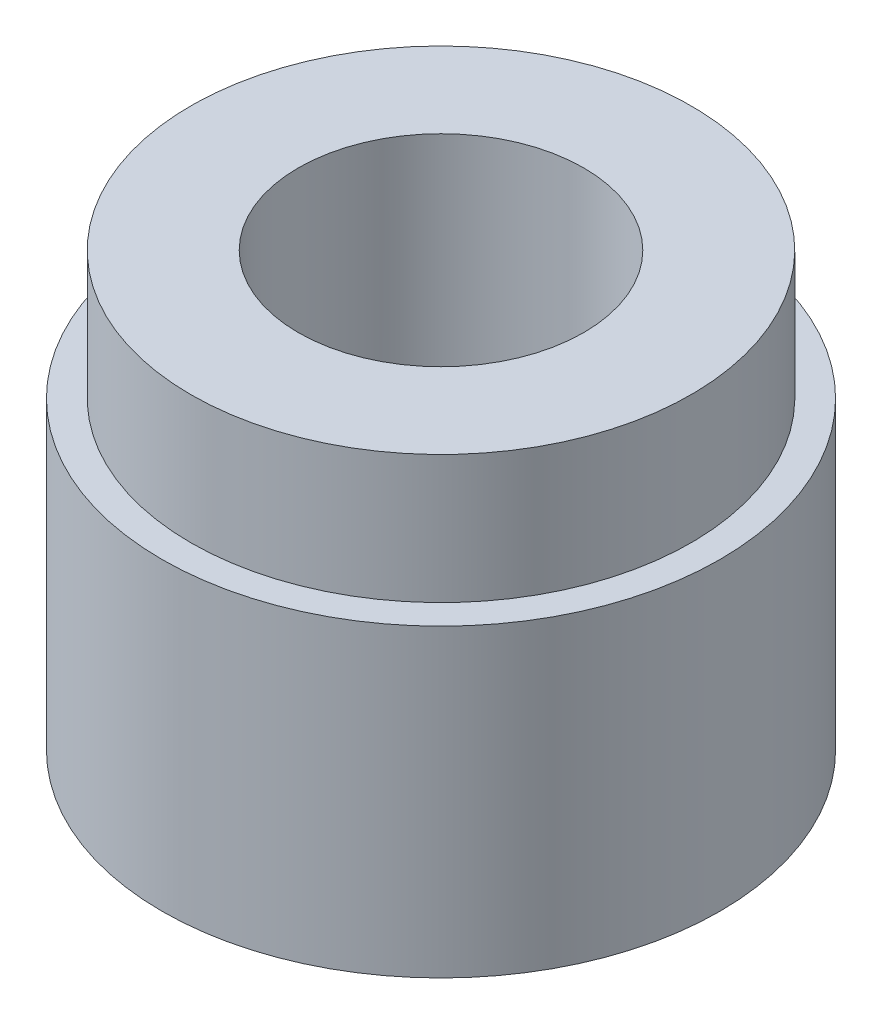
ISO-10303-21;
HEADER;
FILE_DESCRIPTION(('STEP AP214'),'2;1');
FILE_NAME('part.step','',(''),(''),'','','');
FILE_SCHEMA(('AUTOMOTIVE_DESIGN { 1 0 10303 214 1 1 1 1 }'));
ENDSEC;
DATA;
#1=APPLICATION_CONTEXT('core data for automotive mechanical design processes');
#2=APPLICATION_PROTOCOL_DEFINITION('international standard','automotive_design',2000,#1);
#3=PRODUCT_CONTEXT('',#1,'mechanical');
#4=PRODUCT('Part','Part','',(#3));
#5=PRODUCT_RELATED_PRODUCT_CATEGORY('part','',(#4));
#6=PRODUCT_DEFINITION_FORMATION('','',#4);
#7=PRODUCT_DEFINITION_CONTEXT('part definition',#1,'design');
#8=PRODUCT_DEFINITION('design','',#6,#7);
#9=PRODUCT_DEFINITION_SHAPE('','',#8);
#10=(LENGTH_UNIT() NAMED_UNIT(*) SI_UNIT(.MILLI.,.METRE.));
#11=(NAMED_UNIT(*) PLANE_ANGLE_UNIT() SI_UNIT($,.RADIAN.));
#12=(NAMED_UNIT(*) SI_UNIT($,.STERADIAN.) SOLID_ANGLE_UNIT());
#13=UNCERTAINTY_MEASURE_WITH_UNIT(LENGTH_MEASURE(1.E-05),#10,'distance_accuracy_value','');
#14=(GEOMETRIC_REPRESENTATION_CONTEXT(3) GLOBAL_UNCERTAINTY_ASSIGNED_CONTEXT((#13)) GLOBAL_UNIT_ASSIGNED_CONTEXT((#10,
#11,#12)) REPRESENTATION_CONTEXT('',''));
#15=CARTESIAN_POINT('',(0.,0.,0.));
#16=DIRECTION('',(0.,0.,1.));
#17=DIRECTION('',(1.,0.,0.));
#18=AXIS2_PLACEMENT_3D('',#15,#16,#17);
#19=CARTESIAN_POINT('',(0.,3.429,0.));
#20=DIRECTION('',(0.,-1.,0.));
#21=DIRECTION('',(0.,0.,-1.));
#22=AXIS2_PLACEMENT_3D('',#19,#20,#21);
#23=CYLINDRICAL_SURFACE('',#22,2.2098);
#24=CARTESIAN_POINT('',(0.,0.,0.));
#25=DIRECTION('',(0.,1.,0.));
#26=DIRECTION('',(0.,0.,1.));
#27=AXIS2_PLACEMENT_3D('',#24,#25,#26);
#28=CIRCLE('',#27,2.2098);
#29=CARTESIAN_POINT('',(0.,0.,2.2098));
#30=VERTEX_POINT('',#29);
#31=EDGE_CURVE('E11',#30,#30,#28,.T.);
#32=ORIENTED_EDGE('',*,*,#31,.T.);
#33=EDGE_LOOP('',(#32));
#34=FACE_BOUND('',#33,.T.);
#35=CARTESIAN_POINT('',(0.,2.413,0.));
#36=DIRECTION('',(0.,1.,0.));
#37=DIRECTION('',(0.,0.,1.));
#38=AXIS2_PLACEMENT_3D('',#35,#36,#37);
#39=CIRCLE('',#38,2.2098);
#40=CARTESIAN_POINT('',(0.,2.413,2.2098));
#41=VERTEX_POINT('',#40);
#42=EDGE_CURVE('E41',#41,#41,#39,.T.);
#43=ORIENTED_EDGE('',*,*,#42,.F.);
#44=EDGE_LOOP('',(#43));
#45=FACE_BOUND('',#44,.T.);
#46=ADVANCED_FACE('F34',(#34,#45),#23,.T.);
#47=CARTESIAN_POINT('',(0.,0.,0.));
#48=DIRECTION('',(0.,1.,0.));
#49=DIRECTION('',(0.,0.,1.));
#50=AXIS2_PLACEMENT_3D('',#47,#48,#49);
#51=PLANE('',#50);
#52=CARTESIAN_POINT('',(0.,0.,0.));
#53=DIRECTION('',(0.,-1.,0.));
#54=DIRECTION('',(0.,0.,-1.));
#55=AXIS2_PLACEMENT_3D('',#52,#53,#54);
#56=CIRCLE('',#55,1.1303);
#57=CARTESIAN_POINT('',(0.,0.,-1.1303));
#58=VERTEX_POINT('',#57);
#59=EDGE_CURVE('E53',#58,#58,#56,.T.);
#60=ORIENTED_EDGE('',*,*,#59,.F.);
#61=EDGE_LOOP('',(#60));
#62=FACE_BOUND('',#61,.T.);
#63=ORIENTED_EDGE('',*,*,#31,.F.);
#64=EDGE_LOOP('',(#63));
#65=FACE_BOUND('',#64,.T.);
#66=ADVANCED_FACE('F76',(#62,#65),#51,.F.);
#67=CARTESIAN_POINT('',(0.,2.413,0.));
#68=DIRECTION('',(0.,1.,0.));
#69=DIRECTION('',(0.,0.,1.));
#70=AXIS2_PLACEMENT_3D('',#67,#68,#69);
#71=PLANE('',#70);
#72=CARTESIAN_POINT('',(0.,2.413,0.));
#73=DIRECTION('',(0.,1.,0.));
#74=DIRECTION('',(0.,0.,1.));
#75=AXIS2_PLACEMENT_3D('',#72,#73,#74);
#76=CIRCLE('',#75,1.9812);
#77=CARTESIAN_POINT('',(0.,2.413,1.9812));
#78=VERTEX_POINT('',#77);
#79=EDGE_CURVE('E46',#78,#78,#76,.T.);
#80=ORIENTED_EDGE('',*,*,#79,.F.);
#81=EDGE_LOOP('',(#80));
#82=FACE_BOUND('',#81,.T.);
#83=ORIENTED_EDGE('',*,*,#42,.T.);
#84=EDGE_LOOP('',(#83));
#85=FACE_BOUND('',#84,.T.);
#86=ADVANCED_FACE('F70',(#82,#85),#71,.T.);
#87=CARTESIAN_POINT('',(0.,2.413,0.));
#88=DIRECTION('',(0.,1.,0.));
#89=DIRECTION('',(0.,0.,1.));
#90=AXIS2_PLACEMENT_3D('',#87,#88,#89);
#91=CYLINDRICAL_SURFACE('',#90,1.9812);
#92=ORIENTED_EDGE('',*,*,#79,.T.);
#93=EDGE_LOOP('',(#92));
#94=FACE_BOUND('',#93,.T.);
#95=CARTESIAN_POINT('',(0.,3.429,0.));
#96=DIRECTION('',(0.,1.,0.));
#97=DIRECTION('',(0.,0.,1.));
#98=AXIS2_PLACEMENT_3D('',#95,#96,#97);
#99=CIRCLE('',#98,1.9812);
#100=CARTESIAN_POINT('',(0.,3.429,1.9812));
#101=VERTEX_POINT('',#100);
#102=EDGE_CURVE('E48',#101,#101,#99,.T.);
#103=ORIENTED_EDGE('',*,*,#102,.F.);
#104=EDGE_LOOP('',(#103));
#105=FACE_BOUND('',#104,.T.);
#106=ADVANCED_FACE('F65',(#94,#105),#91,.T.);
#107=CARTESIAN_POINT('',(0.,3.429,0.));
#108=DIRECTION('',(0.,1.,0.));
#109=DIRECTION('',(0.,0.,1.));
#110=AXIS2_PLACEMENT_3D('',#107,#108,#109);
#111=PLANE('',#110);
#112=CARTESIAN_POINT('',(0.,3.429,0.));
#113=DIRECTION('',(0.,1.,0.));
#114=DIRECTION('',(0.,0.,1.));
#115=AXIS2_PLACEMENT_3D('',#112,#113,#114);
#116=CIRCLE('',#115,1.1303);
#117=CARTESIAN_POINT('',(0.,3.429,1.1303));
#118=VERTEX_POINT('',#117);
#119=EDGE_CURVE('E37',#118,#118,#116,.T.);
#120=ORIENTED_EDGE('',*,*,#119,.F.);
#121=EDGE_LOOP('',(#120));
#122=FACE_BOUND('',#121,.T.);
#123=ORIENTED_EDGE('',*,*,#102,.T.);
#124=EDGE_LOOP('',(#123));
#125=FACE_BOUND('',#124,.T.);
#126=ADVANCED_FACE('F62',(#122,#125),#111,.T.);
#127=CARTESIAN_POINT('',(0.,0.,0.));
#128=DIRECTION('',(0.,-1.,0.));
#129=DIRECTION('',(0.,0.,-1.));
#130=AXIS2_PLACEMENT_3D('',#127,#128,#129);
#131=CYLINDRICAL_SURFACE('',#130,1.1303);
#132=ORIENTED_EDGE('',*,*,#119,.T.);
#133=EDGE_LOOP('',(#132));
#134=FACE_BOUND('',#133,.T.);
#135=ORIENTED_EDGE('',*,*,#59,.T.);
#136=EDGE_LOOP('',(#135));
#137=FACE_BOUND('',#136,.T.);
#138=ADVANCED_FACE('F60',(#134,#137),#131,.F.);
#139=CLOSED_SHELL('',(#46,#66,#86,#106,#126,#138));
#140=MANIFOLD_SOLID_BREP('B2',#139);
#141=ADVANCED_BREP_SHAPE_REPRESENTATION('',(#18,#140),#14);
#142=SHAPE_DEFINITION_REPRESENTATION(#9,#141);
ENDSEC;
END-ISO-10303-21;
